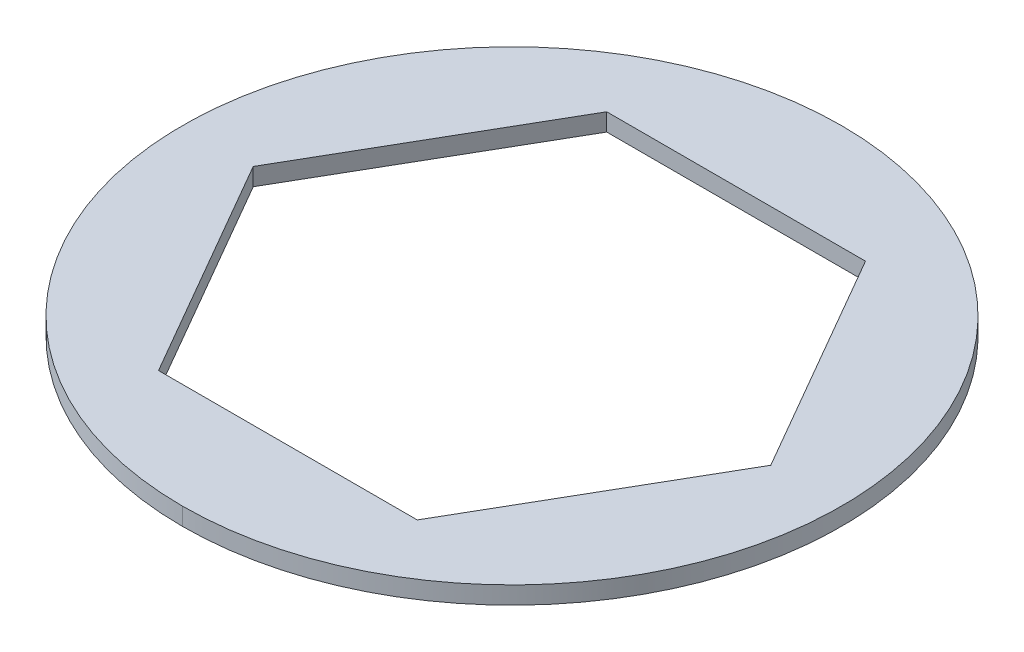
ISO-10303-21;
HEADER;
FILE_DESCRIPTION(('STEP AP214'),'2;1');
FILE_NAME('part.step','',(''),(''),'','','');
FILE_SCHEMA(('AUTOMOTIVE_DESIGN { 1 0 10303 214 1 1 1 1 }'));
ENDSEC;
DATA;
#1=APPLICATION_CONTEXT('core data for automotive mechanical design processes');
#2=APPLICATION_PROTOCOL_DEFINITION('international standard','automotive_design',2000,#1);
#3=PRODUCT_CONTEXT('',#1,'mechanical');
#4=PRODUCT('Part','Part','',(#3));
#5=PRODUCT_RELATED_PRODUCT_CATEGORY('part','',(#4));
#6=PRODUCT_DEFINITION_FORMATION('','',#4);
#7=PRODUCT_DEFINITION_CONTEXT('part definition',#1,'design');
#8=PRODUCT_DEFINITION('design','',#6,#7);
#9=PRODUCT_DEFINITION_SHAPE('','',#8);
#10=(LENGTH_UNIT() NAMED_UNIT(*) SI_UNIT(.MILLI.,.METRE.));
#11=(NAMED_UNIT(*) PLANE_ANGLE_UNIT() SI_UNIT($,.RADIAN.));
#12=(NAMED_UNIT(*) SI_UNIT($,.STERADIAN.) SOLID_ANGLE_UNIT());
#13=UNCERTAINTY_MEASURE_WITH_UNIT(LENGTH_MEASURE(1.E-05),#10,'distance_accuracy_value','');
#14=(GEOMETRIC_REPRESENTATION_CONTEXT(3) GLOBAL_UNCERTAINTY_ASSIGNED_CONTEXT((#13)) GLOBAL_UNIT_ASSIGNED_CONTEXT((#10,
#11,#12)) REPRESENTATION_CONTEXT('',''));
#15=CARTESIAN_POINT('',(0.,0.,0.));
#16=DIRECTION('',(0.,0.,1.));
#17=DIRECTION('',(1.,0.,0.));
#18=AXIS2_PLACEMENT_3D('',#15,#16,#17);
#19=CARTESIAN_POINT('',(-3.7394976935412,0.254,6.477));
#20=DIRECTION('',(0.,0.,-1.));
#21=DIRECTION('',(0.,-1.,0.));
#22=AXIS2_PLACEMENT_3D('',#19,#20,#21);
#23=PLANE('',#22);
#24=DIRECTION('',(1.,0.,0.));
#25=VECTOR('',#24,1.);
#26=CARTESIAN_POINT('',(-3.7394976935412,-0.254,6.477));
#27=LINE('',#26,#25);
#28=CARTESIAN_POINT('',(-3.7394976935412,-0.254,6.477));
#29=VERTEX_POINT('',#28);
#30=CARTESIAN_POINT('',(3.73949769354121,-0.254,6.477));
#31=VERTEX_POINT('',#30);
#32=EDGE_CURVE('E167',#29,#31,#27,.T.);
#33=ORIENTED_EDGE('',*,*,#32,.F.);
#34=DIRECTION('',(0.,-1.,0.));
#35=VECTOR('',#34,1.);
#36=CARTESIAN_POINT('',(-3.7394976935412,0.254,6.477));
#37=LINE('',#36,#35);
#38=CARTESIAN_POINT('',(-3.7394976935412,0.254,6.477));
#39=VERTEX_POINT('',#38);
#40=EDGE_CURVE('E11',#39,#29,#37,.T.);
#41=ORIENTED_EDGE('',*,*,#40,.F.);
#42=DIRECTION('',(1.,0.,0.));
#43=VECTOR('',#42,1.);
#44=CARTESIAN_POINT('',(-3.7394976935412,0.254,6.477));
#45=LINE('',#44,#43);
#46=CARTESIAN_POINT('',(3.73949769354121,0.254,6.477));
#47=VERTEX_POINT('',#46);
#48=EDGE_CURVE('E193',#39,#47,#45,.T.);
#49=ORIENTED_EDGE('',*,*,#48,.T.);
#50=DIRECTION('',(0.,-1.,0.));
#51=VECTOR('',#50,1.);
#52=CARTESIAN_POINT('',(3.73949769354121,0.254,6.477));
#53=LINE('',#52,#51);
#54=EDGE_CURVE('E93',#47,#31,#53,.T.);
#55=ORIENTED_EDGE('',*,*,#54,.T.);
#56=EDGE_LOOP('',(#33,#41,#49,#55));
#57=FACE_BOUND('',#56,.T.);
#58=ADVANCED_FACE('F16',(#57),#23,.T.);
#59=CARTESIAN_POINT('',(-7.47899538708241,0.254,0.));
#60=DIRECTION('',(0.866025403784439,0.,-0.5));
#61=DIRECTION('',(0.,-1.,0.));
#62=AXIS2_PLACEMENT_3D('',#59,#60,#61);
#63=PLANE('',#62);
#64=DIRECTION('',(0.5,0.,0.866025403784439));
#65=VECTOR('',#64,1.);
#66=CARTESIAN_POINT('',(-7.47899538708241,-0.254,0.));
#67=LINE('',#66,#65);
#68=CARTESIAN_POINT('',(-7.47899538708241,-0.254,0.));
#69=VERTEX_POINT('',#68);
#70=EDGE_CURVE('E174',#69,#29,#67,.T.);
#71=ORIENTED_EDGE('',*,*,#70,.F.);
#72=DIRECTION('',(0.,-1.,0.));
#73=VECTOR('',#72,1.);
#74=CARTESIAN_POINT('',(-7.47899538708241,0.254,0.));
#75=LINE('',#74,#73);
#76=CARTESIAN_POINT('',(-7.47899538708241,0.254,0.));
#77=VERTEX_POINT('',#76);
#78=EDGE_CURVE('E27',#77,#69,#75,.T.);
#79=ORIENTED_EDGE('',*,*,#78,.F.);
#80=DIRECTION('',(0.5,0.,0.866025403784439));
#81=VECTOR('',#80,1.);
#82=CARTESIAN_POINT('',(-7.47899538708241,0.254,0.));
#83=LINE('',#82,#81);
#84=EDGE_CURVE('E196',#77,#39,#83,.T.);
#85=ORIENTED_EDGE('',*,*,#84,.T.);
#86=ORIENTED_EDGE('',*,*,#40,.T.);
#87=EDGE_LOOP('',(#71,#79,#85,#86));
#88=FACE_BOUND('',#87,.T.);
#89=ADVANCED_FACE('F205',(#88),#63,.T.);
#90=CARTESIAN_POINT('',(-3.7394976935412,0.254,-6.477));
#91=DIRECTION('',(0.866025403784439,0.,0.5));
#92=DIRECTION('',(0.,-1.,0.));
#93=AXIS2_PLACEMENT_3D('',#90,#91,#92);
#94=PLANE('',#93);
#95=DIRECTION('',(-0.5,0.,0.866025403784439));
#96=VECTOR('',#95,1.);
#97=CARTESIAN_POINT('',(-3.7394976935412,-0.254,-6.477));
#98=LINE('',#97,#96);
#99=CARTESIAN_POINT('',(-3.7394976935412,-0.254,-6.477));
#100=VERTEX_POINT('',#99);
#101=EDGE_CURVE('E154',#100,#69,#98,.T.);
#102=ORIENTED_EDGE('',*,*,#101,.F.);
#103=DIRECTION('',(0.,-1.,0.));
#104=VECTOR('',#103,1.);
#105=CARTESIAN_POINT('',(-3.7394976935412,0.254,-6.477));
#106=LINE('',#105,#104);
#107=CARTESIAN_POINT('',(-3.7394976935412,0.254,-6.477));
#108=VERTEX_POINT('',#107);
#109=EDGE_CURVE('E161',#108,#100,#106,.T.);
#110=ORIENTED_EDGE('',*,*,#109,.F.);
#111=DIRECTION('',(-0.5,0.,0.866025403784439));
#112=VECTOR('',#111,1.);
#113=CARTESIAN_POINT('',(-3.7394976935412,0.254,-6.477));
#114=LINE('',#113,#112);
#115=EDGE_CURVE('E149',#108,#77,#114,.T.);
#116=ORIENTED_EDGE('',*,*,#115,.T.);
#117=ORIENTED_EDGE('',*,*,#78,.T.);
#118=EDGE_LOOP('',(#102,#110,#116,#117));
#119=FACE_BOUND('',#118,.T.);
#120=ADVANCED_FACE('F216',(#119),#94,.T.);
#121=CARTESIAN_POINT('',(3.7394976935412,0.254,-6.477));
#122=DIRECTION('',(0.,0.,1.));
#123=DIRECTION('',(1.,0.,0.));
#124=AXIS2_PLACEMENT_3D('',#121,#122,#123);
#125=PLANE('',#124);
#126=DIRECTION('',(-1.,0.,0.));
#127=VECTOR('',#126,1.);
#128=CARTESIAN_POINT('',(3.7394976935412,-0.254,-6.477));
#129=LINE('',#128,#127);
#130=CARTESIAN_POINT('',(3.7394976935412,-0.254,-6.477));
#131=VERTEX_POINT('',#130);
#132=EDGE_CURVE('E150',#131,#100,#129,.T.);
#133=ORIENTED_EDGE('',*,*,#132,.F.);
#134=DIRECTION('',(0.,-1.,0.));
#135=VECTOR('',#134,1.);
#136=CARTESIAN_POINT('',(3.7394976935412,0.254,-6.477));
#137=LINE('',#136,#135);
#138=CARTESIAN_POINT('',(3.7394976935412,0.254,-6.477));
#139=VERTEX_POINT('',#138);
#140=EDGE_CURVE('E106',#139,#131,#137,.T.);
#141=ORIENTED_EDGE('',*,*,#140,.F.);
#142=DIRECTION('',(-1.,0.,0.));
#143=VECTOR('',#142,1.);
#144=CARTESIAN_POINT('',(3.7394976935412,0.254,-6.477));
#145=LINE('',#144,#143);
#146=EDGE_CURVE('E130',#139,#108,#145,.T.);
#147=ORIENTED_EDGE('',*,*,#146,.T.);
#148=ORIENTED_EDGE('',*,*,#109,.T.);
#149=EDGE_LOOP('',(#133,#141,#147,#148));
#150=FACE_BOUND('',#149,.T.);
#151=ADVANCED_FACE('F324',(#150),#125,.T.);
#152=CARTESIAN_POINT('',(7.47899538708241,0.254,0.));
#153=DIRECTION('',(-0.866025403784439,0.,0.5));
#154=DIRECTION('',(0.,1.,0.));
#155=AXIS2_PLACEMENT_3D('',#152,#153,#154);
#156=PLANE('',#155);
#157=DIRECTION('',(-0.5,0.,-0.866025403784439));
#158=VECTOR('',#157,1.);
#159=CARTESIAN_POINT('',(7.47899538708241,-0.254,0.));
#160=LINE('',#159,#158);
#161=CARTESIAN_POINT('',(7.47899538708241,-0.254,0.));
#162=VERTEX_POINT('',#161);
#163=EDGE_CURVE('E155',#162,#131,#160,.T.);
#164=ORIENTED_EDGE('',*,*,#163,.F.);
#165=DIRECTION('',(0.,-1.,0.));
#166=VECTOR('',#165,1.);
#167=CARTESIAN_POINT('',(7.47899538708241,0.254,0.));
#168=LINE('',#167,#166);
#169=CARTESIAN_POINT('',(7.47899538708241,0.254,0.));
#170=VERTEX_POINT('',#169);
#171=EDGE_CURVE('E166',#170,#162,#168,.T.);
#172=ORIENTED_EDGE('',*,*,#171,.F.);
#173=DIRECTION('',(-0.5,0.,-0.866025403784439));
#174=VECTOR('',#173,1.);
#175=CARTESIAN_POINT('',(7.47899538708241,0.254,0.));
#176=LINE('',#175,#174);
#177=EDGE_CURVE('E158',#170,#139,#176,.T.);
#178=ORIENTED_EDGE('',*,*,#177,.T.);
#179=ORIENTED_EDGE('',*,*,#140,.T.);
#180=EDGE_LOOP('',(#164,#172,#178,#179));
#181=FACE_BOUND('',#180,.T.);
#182=ADVANCED_FACE('F219',(#181),#156,.T.);
#183=CARTESIAN_POINT('',(3.73949769354121,0.254,6.477));
#184=DIRECTION('',(-0.866025403784439,0.,-0.5));
#185=DIRECTION('',(-0.5,0.,0.866025403784439));
#186=AXIS2_PLACEMENT_3D('',#183,#184,#185);
#187=PLANE('',#186);
#188=DIRECTION('',(0.5,0.,-0.866025403784439));
#189=VECTOR('',#188,1.);
#190=CARTESIAN_POINT('',(3.73949769354121,-0.254,6.477));
#191=LINE('',#190,#189);
#192=EDGE_CURVE('E129',#31,#162,#191,.T.);
#193=ORIENTED_EDGE('',*,*,#192,.F.);
#194=ORIENTED_EDGE('',*,*,#54,.F.);
#195=DIRECTION('',(0.5,0.,-0.866025403784439));
#196=VECTOR('',#195,1.);
#197=CARTESIAN_POINT('',(3.73949769354121,0.254,6.477));
#198=LINE('',#197,#196);
#199=EDGE_CURVE('E20',#47,#170,#198,.T.);
#200=ORIENTED_EDGE('',*,*,#199,.T.);
#201=ORIENTED_EDGE('',*,*,#171,.T.);
#202=EDGE_LOOP('',(#193,#194,#200,#201));
#203=FACE_BOUND('',#202,.T.);
#204=ADVANCED_FACE('F220',(#203),#187,.T.);
#205=CARTESIAN_POINT('',(0.,0.254,0.));
#206=DIRECTION('',(0.,-1.,0.));
#207=DIRECTION('',(0.,0.,-1.));
#208=AXIS2_PLACEMENT_3D('',#205,#206,#207);
#209=CYLINDRICAL_SURFACE('',#208,9.525);
#210=DIRECTION('',(0.,-1.,0.));
#211=VECTOR('',#210,1.);
#212=CARTESIAN_POINT('',(0.,0.254,9.525));
#213=LINE('',#212,#211);
#214=CARTESIAN_POINT('',(0.,0.254,9.525));
#215=VERTEX_POINT('',#214);
#216=CARTESIAN_POINT('',(0.,-0.254,9.525));
#217=VERTEX_POINT('',#216);
#218=EDGE_CURVE('E123',#215,#217,#213,.T.);
#219=ORIENTED_EDGE('',*,*,#218,.F.);
#220=CARTESIAN_POINT('',(0.,0.254,0.));
#221=DIRECTION('',(0.,1.,0.));
#222=DIRECTION('',(0.,0.,1.));
#223=AXIS2_PLACEMENT_3D('',#220,#221,#222);
#224=CIRCLE('',#223,9.525);
#225=CARTESIAN_POINT('',(0.,0.254,-9.525));
#226=VERTEX_POINT('',#225);
#227=EDGE_CURVE('E114',#226,#215,#224,.T.);
#228=ORIENTED_EDGE('',*,*,#227,.F.);
#229=DIRECTION('',(0.,-1.,0.));
#230=VECTOR('',#229,1.);
#231=CARTESIAN_POINT('',(0.,0.254,-9.525));
#232=LINE('',#231,#230);
#233=CARTESIAN_POINT('',(0.,-0.254,-9.525));
#234=VERTEX_POINT('',#233);
#235=EDGE_CURVE('E125',#226,#234,#232,.T.);
#236=ORIENTED_EDGE('',*,*,#235,.T.);
#237=CARTESIAN_POINT('',(0.,-0.254,0.));
#238=DIRECTION('',(0.,1.,0.));
#239=DIRECTION('',(0.,0.,1.));
#240=AXIS2_PLACEMENT_3D('',#237,#238,#239);
#241=CIRCLE('',#240,9.525);
#242=EDGE_CURVE('E120',#234,#217,#241,.T.);
#243=ORIENTED_EDGE('',*,*,#242,.T.);
#244=EDGE_LOOP('',(#219,#228,#236,#243));
#245=FACE_BOUND('',#244,.T.);
#246=ADVANCED_FACE('F18',(#245),#209,.T.);
#247=CARTESIAN_POINT('',(0.,-0.254,0.));
#248=DIRECTION('',(0.,1.,0.));
#249=DIRECTION('',(1.,0.,0.));
#250=AXIS2_PLACEMENT_3D('',#247,#248,#249);
#251=PLANE('',#250);
#252=ORIENTED_EDGE('',*,*,#192,.T.);
#253=ORIENTED_EDGE('',*,*,#163,.T.);
#254=ORIENTED_EDGE('',*,*,#132,.T.);
#255=ORIENTED_EDGE('',*,*,#101,.T.);
#256=ORIENTED_EDGE('',*,*,#70,.T.);
#257=ORIENTED_EDGE('',*,*,#32,.T.);
#258=EDGE_LOOP('',(#252,#253,#254,#255,#256,#257));
#259=FACE_BOUND('',#258,.T.);
#260=ORIENTED_EDGE('',*,*,#242,.F.);
#261=CARTESIAN_POINT('',(0.,-0.254,0.));
#262=DIRECTION('',(0.,1.,0.));
#263=DIRECTION('',(0.,0.,1.));
#264=AXIS2_PLACEMENT_3D('',#261,#262,#263);
#265=CIRCLE('',#264,9.525);
#266=EDGE_CURVE('E132',#217,#234,#265,.T.);
#267=ORIENTED_EDGE('',*,*,#266,.F.);
#268=EDGE_LOOP('',(#260,#267));
#269=FACE_BOUND('',#268,.T.);
#270=ADVANCED_FACE('F133',(#259,#269),#251,.F.);
#271=CARTESIAN_POINT('',(0.,0.254,0.));
#272=DIRECTION('',(0.,1.,0.));
#273=DIRECTION('',(1.,0.,0.));
#274=AXIS2_PLACEMENT_3D('',#271,#272,#273);
#275=PLANE('',#274);
#276=ORIENTED_EDGE('',*,*,#177,.F.);
#277=ORIENTED_EDGE('',*,*,#199,.F.);
#278=ORIENTED_EDGE('',*,*,#48,.F.);
#279=ORIENTED_EDGE('',*,*,#84,.F.);
#280=ORIENTED_EDGE('',*,*,#115,.F.);
#281=ORIENTED_EDGE('',*,*,#146,.F.);
#282=EDGE_LOOP('',(#276,#277,#278,#279,#280,#281));
#283=FACE_BOUND('',#282,.T.);
#284=ORIENTED_EDGE('',*,*,#227,.T.);
#285=CARTESIAN_POINT('',(0.,0.254,0.));
#286=DIRECTION('',(0.,1.,0.));
#287=DIRECTION('',(0.,0.,1.));
#288=AXIS2_PLACEMENT_3D('',#285,#286,#287);
#289=CIRCLE('',#288,9.525);
#290=EDGE_CURVE('E139',#215,#226,#289,.T.);
#291=ORIENTED_EDGE('',*,*,#290,.T.);
#292=EDGE_LOOP('',(#284,#291));
#293=FACE_BOUND('',#292,.T.);
#294=ADVANCED_FACE('F210',(#283,#293),#275,.T.);
#295=CARTESIAN_POINT('',(0.,0.254,0.));
#296=DIRECTION('',(0.,-1.,0.));
#297=DIRECTION('',(0.,0.,-1.));
#298=AXIS2_PLACEMENT_3D('',#295,#296,#297);
#299=CYLINDRICAL_SURFACE('',#298,9.525);
#300=ORIENTED_EDGE('',*,*,#290,.F.);
#301=ORIENTED_EDGE('',*,*,#218,.T.);
#302=ORIENTED_EDGE('',*,*,#266,.T.);
#303=ORIENTED_EDGE('',*,*,#235,.F.);
#304=EDGE_LOOP('',(#300,#301,#302,#303));
#305=FACE_BOUND('',#304,.T.);
#306=ADVANCED_FACE('F137',(#305),#299,.T.);
#307=CLOSED_SHELL('',(#58,#89,#120,#151,#182,#204,#246,#270,#294,#306));
#308=MANIFOLD_SOLID_BREP('B1',#307);
#309=ADVANCED_BREP_SHAPE_REPRESENTATION('',(#18,#308),#14);
#310=SHAPE_DEFINITION_REPRESENTATION(#9,#309);
ENDSEC;
END-ISO-10303-21;
